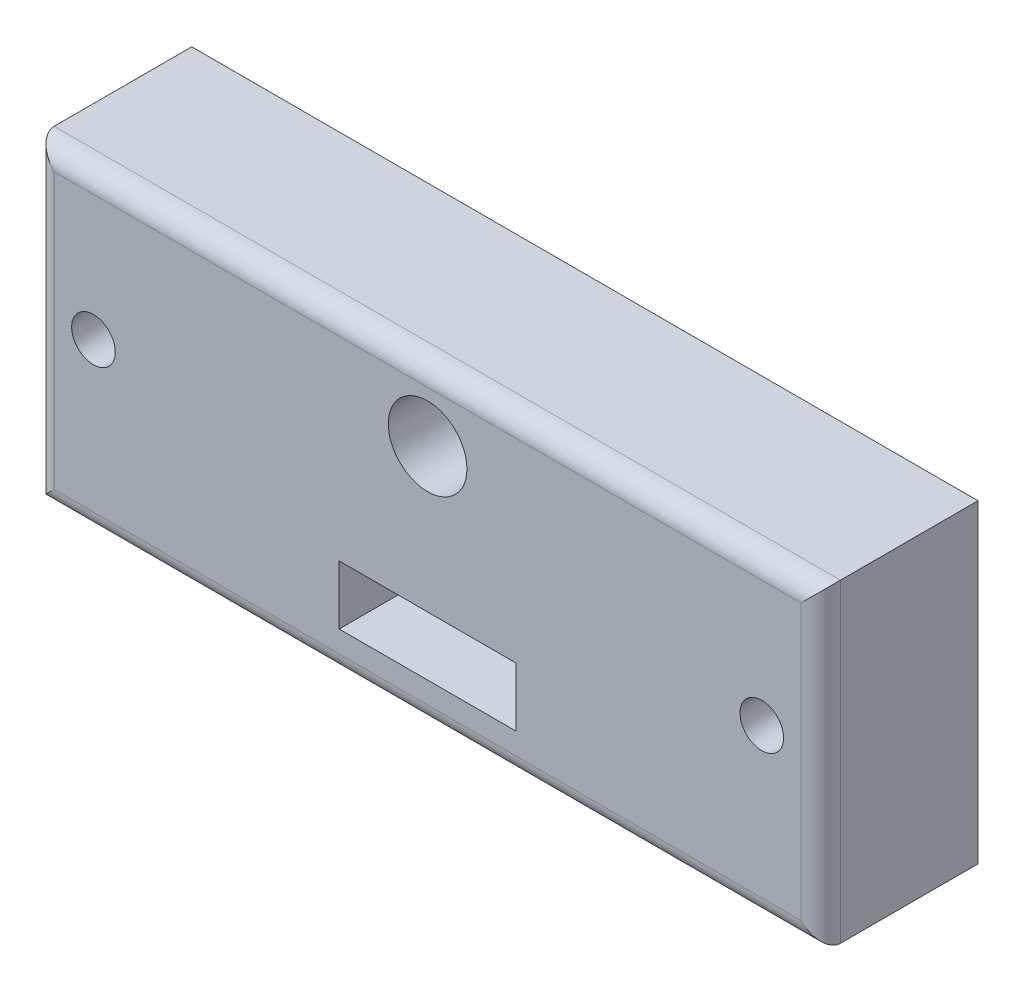
ISO-10303-21;
HEADER;
FILE_DESCRIPTION(('STEP AP214'),'2;1');
FILE_NAME('part.step','',(''),(''),'','','');
FILE_SCHEMA(('AUTOMOTIVE_DESIGN { 1 0 10303 214 1 1 1 1 }'));
ENDSEC;
DATA;
#1=APPLICATION_CONTEXT('core data for automotive mechanical design processes');
#2=APPLICATION_PROTOCOL_DEFINITION('international standard','automotive_design',2000,#1);
#3=PRODUCT_CONTEXT('',#1,'mechanical');
#4=PRODUCT('Part','Part','',(#3));
#5=PRODUCT_RELATED_PRODUCT_CATEGORY('part','',(#4));
#6=PRODUCT_DEFINITION_FORMATION('','',#4);
#7=PRODUCT_DEFINITION_CONTEXT('part definition',#1,'design');
#8=PRODUCT_DEFINITION('design','',#6,#7);
#9=PRODUCT_DEFINITION_SHAPE('','',#8);
#10=(LENGTH_UNIT() NAMED_UNIT(*) SI_UNIT(.MILLI.,.METRE.));
#11=(NAMED_UNIT(*) PLANE_ANGLE_UNIT() SI_UNIT($,.RADIAN.));
#12=(NAMED_UNIT(*) SI_UNIT($,.STERADIAN.) SOLID_ANGLE_UNIT());
#13=UNCERTAINTY_MEASURE_WITH_UNIT(LENGTH_MEASURE(1.E-05),#10,'distance_accuracy_value','');
#14=(GEOMETRIC_REPRESENTATION_CONTEXT(3) GLOBAL_UNCERTAINTY_ASSIGNED_CONTEXT((#13)) GLOBAL_UNIT_ASSIGNED_CONTEXT((#10,
#11,#12)) REPRESENTATION_CONTEXT('',''));
#15=CARTESIAN_POINT('',(0.,0.,0.));
#16=DIRECTION('',(0.,0.,1.));
#17=DIRECTION('',(1.,0.,0.));
#18=AXIS2_PLACEMENT_3D('',#15,#16,#17);
#19=CARTESIAN_POINT('',(228.6,198.303614457831,0.));
#20=DIRECTION('',(0.,0.,1.));
#21=DIRECTION('',(1.,0.,0.));
#22=AXIS2_PLACEMENT_3D('',#19,#20,#21);
#23=PLANE('',#22);
#24=CARTESIAN_POINT('',(174.625,200.208614457832,0.));
#25=DIRECTION('',(0.,0.,1.));
#26=DIRECTION('',(1.,0.,0.));
#27=AXIS2_PLACEMENT_3D('',#24,#25,#26);
#28=CIRCLE('',#27,3.52032942867692);
#29=CARTESIAN_POINT('',(178.145329428677,200.208614457832,0.));
#30=VERTEX_POINT('',#29);
#31=EDGE_CURVE('E149',#30,#30,#28,.T.);
#32=ORIENTED_EDGE('',*,*,#31,.T.);
#33=EDGE_LOOP('',(#32));
#34=FACE_BOUND('',#33,.T.);
#35=CARTESIAN_POINT('',(282.575,200.208614457832,0.));
#36=DIRECTION('',(0.,0.,1.));
#37=DIRECTION('',(1.,0.,0.));
#38=AXIS2_PLACEMENT_3D('',#35,#36,#37);
#39=CIRCLE('',#38,3.52032942867692);
#40=CARTESIAN_POINT('',(286.095329428677,200.208614457832,0.));
#41=VERTEX_POINT('',#40);
#42=EDGE_CURVE('E270',#41,#41,#39,.T.);
#43=ORIENTED_EDGE('',*,*,#42,.T.);
#44=EDGE_LOOP('',(#43));
#45=FACE_BOUND('',#44,.T.);
#46=DIRECTION('',(1.,0.,0.));
#47=VECTOR('',#46,1.);
#48=CARTESIAN_POINT('',(165.1,172.903614457831,0.));
#49=LINE('',#48,#47);
#50=CARTESIAN_POINT('',(165.1,172.903614457831,0.));
#51=VERTEX_POINT('',#50);
#52=CARTESIAN_POINT('',(292.1,172.903614457831,0.));
#53=VERTEX_POINT('',#52);
#54=EDGE_CURVE('E11',#51,#53,#49,.T.);
#55=ORIENTED_EDGE('',*,*,#54,.F.);
#56=DIRECTION('',(0.,-1.,0.));
#57=VECTOR('',#56,1.);
#58=CARTESIAN_POINT('',(165.1,223.703614457831,0.));
#59=LINE('',#58,#57);
#60=CARTESIAN_POINT('',(165.1,223.703614457831,0.));
#61=VERTEX_POINT('',#60);
#62=EDGE_CURVE('E242',#61,#51,#59,.T.);
#63=ORIENTED_EDGE('',*,*,#62,.F.);
#64=DIRECTION('',(-1.,0.,0.));
#65=VECTOR('',#64,1.);
#66=CARTESIAN_POINT('',(292.1,223.703614457831,0.));
#67=LINE('',#66,#65);
#68=CARTESIAN_POINT('',(292.1,223.703614457831,0.));
#69=VERTEX_POINT('',#68);
#70=EDGE_CURVE('E187',#69,#61,#67,.T.);
#71=ORIENTED_EDGE('',*,*,#70,.F.);
#72=DIRECTION('',(0.,1.,0.));
#73=VECTOR('',#72,1.);
#74=CARTESIAN_POINT('',(292.1,172.903614457831,0.));
#75=LINE('',#74,#73);
#76=EDGE_CURVE('E197',#53,#69,#75,.T.);
#77=ORIENTED_EDGE('',*,*,#76,.F.);
#78=EDGE_LOOP('',(#55,#63,#71,#77));
#79=FACE_BOUND('',#78,.T.);
#80=ADVANCED_FACE('F17',(#34,#45,#79),#23,.F.);
#81=CARTESIAN_POINT('',(165.1,172.903614457831,0.));
#82=DIRECTION('',(0.,-1.,0.));
#83=DIRECTION('',(-1.,0.,0.));
#84=AXIS2_PLACEMENT_3D('',#81,#82,#83);
#85=PLANE('',#84);
#86=DIRECTION('',(1.,0.,0.));
#87=VECTOR('',#86,1.);
#88=CARTESIAN_POINT('',(196.85,172.903614457831,22.225));
#89=LINE('',#88,#87);
#90=CARTESIAN_POINT('',(165.1,172.903614457831,22.225));
#91=VERTEX_POINT('',#90);
#92=CARTESIAN_POINT('',(292.1,172.903614457831,22.225));
#93=VERTEX_POINT('',#92);
#94=EDGE_CURVE('E176',#91,#93,#89,.T.);
#95=ORIENTED_EDGE('',*,*,#94,.F.);
#96=DIRECTION('',(0.,0.,1.));
#97=VECTOR('',#96,1.);
#98=CARTESIAN_POINT('',(165.1,172.903614457831,0.));
#99=LINE('',#98,#97);
#100=EDGE_CURVE('E20',#51,#91,#99,.T.);
#101=ORIENTED_EDGE('',*,*,#100,.F.);
#102=ORIENTED_EDGE('',*,*,#54,.T.);
#103=DIRECTION('',(0.,0.,1.));
#104=VECTOR('',#103,1.);
#105=CARTESIAN_POINT('',(292.1,172.903614457831,0.));
#106=LINE('',#105,#104);
#107=EDGE_CURVE('E194',#53,#93,#106,.T.);
#108=ORIENTED_EDGE('',*,*,#107,.T.);
#109=EDGE_LOOP('',(#95,#101,#102,#108));
#110=FACE_BOUND('',#109,.T.);
#111=ADVANCED_FACE('F260',(#110),#85,.T.);
#112=CARTESIAN_POINT('',(165.1,223.703614457831,0.));
#113=DIRECTION('',(-1.,0.,0.));
#114=DIRECTION('',(0.,0.,1.));
#115=AXIS2_PLACEMENT_3D('',#112,#113,#114);
#116=PLANE('',#115);
#117=DIRECTION('',(0.,-1.,0.));
#118=VECTOR('',#117,1.);
#119=CARTESIAN_POINT('',(165.1,211.003614457832,22.225));
#120=LINE('',#119,#118);
#121=CARTESIAN_POINT('',(165.1,223.703614457831,22.225));
#122=VERTEX_POINT('',#121);
#123=EDGE_CURVE('E172',#122,#91,#120,.T.);
#124=ORIENTED_EDGE('',*,*,#123,.F.);
#125=DIRECTION('',(0.,0.,1.));
#126=VECTOR('',#125,1.);
#127=CARTESIAN_POINT('',(165.1,223.703614457831,0.));
#128=LINE('',#127,#126);
#129=EDGE_CURVE('E191',#61,#122,#128,.T.);
#130=ORIENTED_EDGE('',*,*,#129,.F.);
#131=ORIENTED_EDGE('',*,*,#62,.T.);
#132=ORIENTED_EDGE('',*,*,#100,.T.);
#133=EDGE_LOOP('',(#124,#130,#131,#132));
#134=FACE_BOUND('',#133,.T.);
#135=ADVANCED_FACE('F253',(#134),#116,.T.);
#136=CARTESIAN_POINT('',(228.6,212.273614457831,13.97));
#137=DIRECTION('',(0.,0.,1.));
#138=DIRECTION('',(1.,0.,0.));
#139=AXIS2_PLACEMENT_3D('',#136,#137,#138);
#140=PLANE('',#139);
#141=CARTESIAN_POINT('',(228.6,212.273614457831,13.97));
#142=DIRECTION('',(0.,0.,-1.));
#143=DIRECTION('',(1.,0.,0.));
#144=AXIS2_PLACEMENT_3D('',#141,#142,#143);
#145=CIRCLE('',#144,6.35);
#146=CARTESIAN_POINT('',(234.95,212.273614457831,13.97));
#147=VERTEX_POINT('',#146);
#148=EDGE_CURVE('E239',#147,#147,#145,.T.);
#149=ORIENTED_EDGE('',*,*,#148,.F.);
#150=EDGE_LOOP('',(#149));
#151=FACE_BOUND('',#150,.T.);
#152=ADVANCED_FACE('F449',(#151),#140,.T.);
#153=CARTESIAN_POINT('',(228.6,212.273614457831,25.4));
#154=DIRECTION('',(0.,0.,-1.));
#155=DIRECTION('',(1.,0.,0.));
#156=AXIS2_PLACEMENT_3D('',#153,#154,#155);
#157=CYLINDRICAL_SURFACE('',#156,6.35);
#158=ORIENTED_EDGE('',*,*,#148,.T.);
#159=EDGE_LOOP('',(#158));
#160=FACE_BOUND('',#159,.T.);
#161=CARTESIAN_POINT('',(228.6,212.273614457831,25.4));
#162=DIRECTION('',(0.,0.,-1.));
#163=DIRECTION('',(1.,0.,0.));
#164=AXIS2_PLACEMENT_3D('',#161,#162,#163);
#165=CIRCLE('',#164,6.35);
#166=CARTESIAN_POINT('',(234.95,212.273614457831,25.4));
#167=VERTEX_POINT('',#166);
#168=EDGE_CURVE('E200',#167,#167,#165,.T.);
#169=ORIENTED_EDGE('',*,*,#168,.F.);
#170=EDGE_LOOP('',(#169));
#171=FACE_BOUND('',#170,.T.);
#172=ADVANCED_FACE('F461',(#160,#171),#157,.F.);
#173=CARTESIAN_POINT('',(228.6,184.333614457832,13.97));
#174=DIRECTION('',(0.,0.,-1.));
#175=DIRECTION('',(0.,-1.,0.));
#176=AXIS2_PLACEMENT_3D('',#173,#174,#175);
#177=PLANE('',#176);
#178=DIRECTION('',(-1.,0.,0.));
#179=VECTOR('',#178,1.);
#180=CARTESIAN_POINT('',(214.3125,179.571114457831,13.97));
#181=LINE('',#180,#179);
#182=CARTESIAN_POINT('',(242.8875,179.571114457831,13.97));
#183=VERTEX_POINT('',#182);
#184=CARTESIAN_POINT('',(214.3125,179.571114457831,13.97));
#185=VERTEX_POINT('',#184);
#186=EDGE_CURVE('E46',#183,#185,#181,.T.);
#187=ORIENTED_EDGE('',*,*,#186,.F.);
#188=DIRECTION('',(0.,-1.,0.));
#189=VECTOR('',#188,1.);
#190=CARTESIAN_POINT('',(242.8875,179.571114457831,13.97));
#191=LINE('',#190,#189);
#192=CARTESIAN_POINT('',(242.8875,189.096114457831,13.97));
#193=VERTEX_POINT('',#192);
#194=EDGE_CURVE('E213',#193,#183,#191,.T.);
#195=ORIENTED_EDGE('',*,*,#194,.F.);
#196=DIRECTION('',(1.,0.,0.));
#197=VECTOR('',#196,1.);
#198=CARTESIAN_POINT('',(242.8875,189.096114457831,13.97));
#199=LINE('',#198,#197);
#200=CARTESIAN_POINT('',(214.3125,189.096114457831,13.97));
#201=VERTEX_POINT('',#200);
#202=EDGE_CURVE('E171',#201,#193,#199,.T.);
#203=ORIENTED_EDGE('',*,*,#202,.F.);
#204=DIRECTION('',(0.,1.,0.));
#205=VECTOR('',#204,1.);
#206=CARTESIAN_POINT('',(214.3125,189.096114457831,13.97));
#207=LINE('',#206,#205);
#208=EDGE_CURVE('E170',#185,#201,#207,.T.);
#209=ORIENTED_EDGE('',*,*,#208,.F.);
#210=EDGE_LOOP('',(#187,#195,#203,#209));
#211=FACE_BOUND('',#210,.T.);
#212=ADVANCED_FACE('F466',(#211),#177,.F.);
#213=CARTESIAN_POINT('',(242.8875,179.571114457831,25.4));
#214=DIRECTION('',(0.,-1.,0.));
#215=DIRECTION('',(-1.,0.,0.));
#216=AXIS2_PLACEMENT_3D('',#213,#214,#215);
#217=PLANE('',#216);
#218=DIRECTION('',(-1.,0.,0.));
#219=VECTOR('',#218,1.);
#220=CARTESIAN_POINT('',(235.743749999999,179.571114457831,25.4));
#221=LINE('',#220,#219);
#222=CARTESIAN_POINT('',(242.8875,179.571114457831,25.4));
#223=VERTEX_POINT('',#222);
#224=CARTESIAN_POINT('',(214.3125,179.571114457831,25.4));
#225=VERTEX_POINT('',#224);
#226=EDGE_CURVE('E208',#223,#225,#221,.T.);
#227=ORIENTED_EDGE('',*,*,#226,.F.);
#228=DIRECTION('',(0.,0.,-1.));
#229=VECTOR('',#228,1.);
#230=CARTESIAN_POINT('',(242.8875,179.571114457831,25.4));
#231=LINE('',#230,#229);
#232=EDGE_CURVE('E217',#223,#183,#231,.T.);
#233=ORIENTED_EDGE('',*,*,#232,.T.);
#234=ORIENTED_EDGE('',*,*,#186,.T.);
#235=DIRECTION('',(0.,0.,-1.));
#236=VECTOR('',#235,1.);
#237=CARTESIAN_POINT('',(214.3125,179.571114457831,25.4));
#238=LINE('',#237,#236);
#239=EDGE_CURVE('E166',#225,#185,#238,.T.);
#240=ORIENTED_EDGE('',*,*,#239,.F.);
#241=EDGE_LOOP('',(#227,#233,#234,#240));
#242=FACE_BOUND('',#241,.T.);
#243=ADVANCED_FACE('F494',(#242),#217,.F.);
#244=CARTESIAN_POINT('',(214.3125,179.571114457831,25.4));
#245=DIRECTION('',(-1.,0.,0.));
#246=DIRECTION('',(0.,0.,1.));
#247=AXIS2_PLACEMENT_3D('',#244,#245,#246);
#248=PLANE('',#247);
#249=DIRECTION('',(0.,1.,0.));
#250=VECTOR('',#249,1.);
#251=CARTESIAN_POINT('',(214.3125,188.937364457831,25.4));
#252=LINE('',#251,#250);
#253=CARTESIAN_POINT('',(214.3125,189.096114457831,25.4));
#254=VERTEX_POINT('',#253);
#255=EDGE_CURVE('E212',#225,#254,#252,.T.);
#256=ORIENTED_EDGE('',*,*,#255,.F.);
#257=ORIENTED_EDGE('',*,*,#239,.T.);
#258=ORIENTED_EDGE('',*,*,#208,.T.);
#259=DIRECTION('',(0.,0.,-1.));
#260=VECTOR('',#259,1.);
#261=CARTESIAN_POINT('',(214.3125,189.096114457831,25.4));
#262=LINE('',#261,#260);
#263=EDGE_CURVE('E231',#254,#201,#262,.T.);
#264=ORIENTED_EDGE('',*,*,#263,.F.);
#265=EDGE_LOOP('',(#256,#257,#258,#264));
#266=FACE_BOUND('',#265,.T.);
#267=ADVANCED_FACE('F416',(#266),#248,.F.);
#268=CARTESIAN_POINT('',(214.3125,189.096114457831,25.4));
#269=DIRECTION('',(0.,1.,0.));
#270=DIRECTION('',(1.,0.,0.));
#271=AXIS2_PLACEMENT_3D('',#268,#269,#270);
#272=PLANE('',#271);
#273=DIRECTION('',(1.,0.,0.));
#274=VECTOR('',#273,1.);
#275=CARTESIAN_POINT('',(221.456249999999,189.096114457831,25.4));
#276=LINE('',#275,#274);
#277=CARTESIAN_POINT('',(242.8875,189.096114457831,25.4));
#278=VERTEX_POINT('',#277);
#279=EDGE_CURVE('E222',#254,#278,#276,.T.);
#280=ORIENTED_EDGE('',*,*,#279,.F.);
#281=ORIENTED_EDGE('',*,*,#263,.T.);
#282=ORIENTED_EDGE('',*,*,#202,.T.);
#283=DIRECTION('',(0.,0.,-1.));
#284=VECTOR('',#283,1.);
#285=CARTESIAN_POINT('',(242.8875,189.096114457831,25.4));
#286=LINE('',#285,#284);
#287=EDGE_CURVE('E218',#278,#193,#286,.T.);
#288=ORIENTED_EDGE('',*,*,#287,.F.);
#289=EDGE_LOOP('',(#280,#281,#282,#288));
#290=FACE_BOUND('',#289,.T.);
#291=ADVANCED_FACE('F410',(#290),#272,.F.);
#292=CARTESIAN_POINT('',(242.8875,189.096114457831,25.4));
#293=DIRECTION('',(1.,0.,0.));
#294=DIRECTION('',(0.,-1.,0.));
#295=AXIS2_PLACEMENT_3D('',#292,#293,#294);
#296=PLANE('',#295);
#297=DIRECTION('',(0.,-1.,0.));
#298=VECTOR('',#297,1.);
#299=CARTESIAN_POINT('',(242.8875,193.699864457831,25.4));
#300=LINE('',#299,#298);
#301=EDGE_CURVE('E204',#278,#223,#300,.T.);
#302=ORIENTED_EDGE('',*,*,#301,.F.);
#303=ORIENTED_EDGE('',*,*,#287,.T.);
#304=ORIENTED_EDGE('',*,*,#194,.T.);
#305=ORIENTED_EDGE('',*,*,#232,.F.);
#306=EDGE_LOOP('',(#302,#303,#304,#305));
#307=FACE_BOUND('',#306,.T.);
#308=ADVANCED_FACE('F415',(#307),#296,.F.);
#309=CARTESIAN_POINT('',(228.6,198.303614457831,25.4));
#310=DIRECTION('',(0.,0.,1.));
#311=DIRECTION('',(1.,0.,0.));
#312=AXIS2_PLACEMENT_3D('',#309,#310,#311);
#313=PLANE('',#312);
#314=ORIENTED_EDGE('',*,*,#301,.T.);
#315=ORIENTED_EDGE('',*,*,#226,.T.);
#316=ORIENTED_EDGE('',*,*,#255,.T.);
#317=ORIENTED_EDGE('',*,*,#279,.T.);
#318=EDGE_LOOP('',(#314,#315,#316,#317));
#319=FACE_BOUND('',#318,.T.);
#320=ORIENTED_EDGE('',*,*,#168,.T.);
#321=EDGE_LOOP('',(#320));
#322=FACE_BOUND('',#321,.T.);
#323=CARTESIAN_POINT('',(174.625,200.208614457832,25.4));
#324=DIRECTION('',(0.,0.,-1.));
#325=DIRECTION('',(1.,0.,0.));
#326=AXIS2_PLACEMENT_3D('',#323,#324,#325);
#327=CIRCLE('',#326,3.52032942867692);
#328=CARTESIAN_POINT('',(178.145329428677,200.208614457832,25.4));
#329=VERTEX_POINT('',#328);
#330=EDGE_CURVE('E158',#329,#329,#327,.T.);
#331=ORIENTED_EDGE('',*,*,#330,.T.);
#332=EDGE_LOOP('',(#331));
#333=FACE_BOUND('',#332,.T.);
#334=CARTESIAN_POINT('',(282.575,200.208614457832,25.4));
#335=DIRECTION('',(0.,0.,-1.));
#336=DIRECTION('',(1.,0.,0.));
#337=AXIS2_PLACEMENT_3D('',#334,#335,#336);
#338=CIRCLE('',#337,3.52032942867692);
#339=CARTESIAN_POINT('',(286.095329428677,200.208614457832,25.4));
#340=VERTEX_POINT('',#339);
#341=EDGE_CURVE('E280',#340,#340,#338,.T.);
#342=ORIENTED_EDGE('',*,*,#341,.T.);
#343=EDGE_LOOP('',(#342));
#344=FACE_BOUND('',#343,.T.);
#345=DIRECTION('',(0.,-1.,0.));
#346=VECTOR('',#345,1.);
#347=CARTESIAN_POINT('',(288.925,185.603614457831,25.4));
#348=LINE('',#347,#346);
#349=CARTESIAN_POINT('',(288.925,220.528614457832,25.4));
#350=VERTEX_POINT('',#349);
#351=CARTESIAN_POINT('',(288.925,176.078614457831,25.4));
#352=VERTEX_POINT('',#351);
#353=EDGE_CURVE('E138',#350,#352,#348,.T.);
#354=ORIENTED_EDGE('',*,*,#353,.F.);
#355=DIRECTION('',(1.,0.,0.));
#356=VECTOR('',#355,1.);
#357=CARTESIAN_POINT('',(260.35,220.528614457832,25.4));
#358=LINE('',#357,#356);
#359=CARTESIAN_POINT('',(168.275,220.528614457832,25.4));
#360=VERTEX_POINT('',#359);
#361=EDGE_CURVE('E119',#360,#350,#358,.T.);
#362=ORIENTED_EDGE('',*,*,#361,.F.);
#363=DIRECTION('',(0.,1.,0.));
#364=VECTOR('',#363,1.);
#365=CARTESIAN_POINT('',(168.275,211.003614457832,25.4));
#366=LINE('',#365,#364);
#367=CARTESIAN_POINT('',(168.275,176.078614457831,25.4));
#368=VERTEX_POINT('',#367);
#369=EDGE_CURVE('E180',#368,#360,#366,.T.);
#370=ORIENTED_EDGE('',*,*,#369,.F.);
#371=DIRECTION('',(-1.,0.,0.));
#372=VECTOR('',#371,1.);
#373=CARTESIAN_POINT('',(196.85,176.078614457831,25.4));
#374=LINE('',#373,#372);
#375=EDGE_CURVE('E142',#352,#368,#374,.T.);
#376=ORIENTED_EDGE('',*,*,#375,.F.);
#377=EDGE_LOOP('',(#354,#362,#370,#376));
#378=FACE_BOUND('',#377,.T.);
#379=ADVANCED_FACE('F144',(#319,#322,#333,#344,#378),#313,.T.);
#380=CARTESIAN_POINT('',(292.1,172.903614457831,0.));
#381=DIRECTION('',(1.,0.,0.));
#382=DIRECTION('',(0.,-1.,0.));
#383=AXIS2_PLACEMENT_3D('',#380,#381,#382);
#384=PLANE('',#383);
#385=DIRECTION('',(0.,1.,0.));
#386=VECTOR('',#385,1.);
#387=CARTESIAN_POINT('',(292.1,185.603614457831,22.225));
#388=LINE('',#387,#386);
#389=CARTESIAN_POINT('',(292.1,223.703614457831,22.225));
#390=VERTEX_POINT('',#389);
#391=EDGE_CURVE('E140',#93,#390,#388,.T.);
#392=ORIENTED_EDGE('',*,*,#391,.F.);
#393=ORIENTED_EDGE('',*,*,#107,.F.);
#394=ORIENTED_EDGE('',*,*,#76,.T.);
#395=DIRECTION('',(0.,0.,1.));
#396=VECTOR('',#395,1.);
#397=CARTESIAN_POINT('',(292.1,223.703614457831,0.));
#398=LINE('',#397,#396);
#399=EDGE_CURVE('E131',#69,#390,#398,.T.);
#400=ORIENTED_EDGE('',*,*,#399,.T.);
#401=EDGE_LOOP('',(#392,#393,#394,#400));
#402=FACE_BOUND('',#401,.T.);
#403=ADVANCED_FACE('F299',(#402),#384,.T.);
#404=CARTESIAN_POINT('',(292.1,223.703614457831,0.));
#405=DIRECTION('',(0.,1.,0.));
#406=DIRECTION('',(1.,0.,0.));
#407=AXIS2_PLACEMENT_3D('',#404,#405,#406);
#408=PLANE('',#407);
#409=DIRECTION('',(-1.,0.,0.));
#410=VECTOR('',#409,1.);
#411=CARTESIAN_POINT('',(260.35,223.703614457831,22.225));
#412=LINE('',#411,#410);
#413=EDGE_CURVE('E132',#390,#122,#412,.T.);
#414=ORIENTED_EDGE('',*,*,#413,.F.);
#415=ORIENTED_EDGE('',*,*,#399,.F.);
#416=ORIENTED_EDGE('',*,*,#70,.T.);
#417=ORIENTED_EDGE('',*,*,#129,.T.);
#418=EDGE_LOOP('',(#414,#415,#416,#417));
#419=FACE_BOUND('',#418,.T.);
#420=ADVANCED_FACE('F302',(#419),#408,.T.);
#421=CARTESIAN_POINT('',(260.35,220.528614457832,22.225));
#422=DIRECTION('',(-1.,0.,0.));
#423=DIRECTION('',(0.,0.70710678118655,0.707106781186545));
#424=AXIS2_PLACEMENT_3D('',#421,#422,#423);
#425=CYLINDRICAL_SURFACE('',#424,3.175);
#426=ORIENTED_EDGE('',*,*,#413,.T.);
#427=CARTESIAN_POINT('',(168.275,220.528614457832,22.225));
#428=DIRECTION('',(-0.707106781186548,-0.707106781186548,0.));
#429=DIRECTION('',(-0.707106781186548,0.707106781186548,0.));
#430=AXIS2_PLACEMENT_3D('',#427,#428,#429);
#431=ELLIPSE('',#430,4.49012806053458,3.175);
#432=EDGE_CURVE('E126',#360,#122,#431,.T.);
#433=ORIENTED_EDGE('',*,*,#432,.F.);
#434=ORIENTED_EDGE('',*,*,#361,.T.);
#435=CARTESIAN_POINT('',(288.925,220.528614457832,22.225));
#436=DIRECTION('',(-0.707106781186548,0.707106781186548,0.));
#437=DIRECTION('',(0.707106781186548,0.707106781186548,0.));
#438=AXIS2_PLACEMENT_3D('',#435,#436,#437);
#439=ELLIPSE('',#438,4.49012806053458,3.175);
#440=EDGE_CURVE('E123',#350,#390,#439,.T.);
#441=ORIENTED_EDGE('',*,*,#440,.T.);
#442=EDGE_LOOP('',(#426,#433,#434,#441));
#443=FACE_BOUND('',#442,.T.);
#444=ADVANCED_FACE('F122',(#443),#425,.T.);
#445=CARTESIAN_POINT('',(168.275,211.003614457832,22.225));
#446=DIRECTION('',(0.,-1.,0.));
#447=DIRECTION('',(-0.707106781186543,0.,0.707106781186552));
#448=AXIS2_PLACEMENT_3D('',#445,#446,#447);
#449=CYLINDRICAL_SURFACE('',#448,3.175);
#450=ORIENTED_EDGE('',*,*,#369,.T.);
#451=ORIENTED_EDGE('',*,*,#432,.T.);
#452=ORIENTED_EDGE('',*,*,#123,.T.);
#453=CARTESIAN_POINT('',(168.275,176.078614457831,22.225));
#454=DIRECTION('',(0.707106781186548,-0.707106781186548,0.));
#455=DIRECTION('',(-0.707106781186548,-0.707106781186548,0.));
#456=AXIS2_PLACEMENT_3D('',#453,#454,#455);
#457=ELLIPSE('',#456,4.49012806053458,3.175);
#458=EDGE_CURVE('E165',#368,#91,#457,.T.);
#459=ORIENTED_EDGE('',*,*,#458,.F.);
#460=EDGE_LOOP('',(#450,#451,#452,#459));
#461=FACE_BOUND('',#460,.T.);
#462=ADVANCED_FACE('F258',(#461),#449,.T.);
#463=CARTESIAN_POINT('',(196.85,176.078614457831,22.225));
#464=DIRECTION('',(1.,0.,0.));
#465=DIRECTION('',(0.,-0.70710678118655,0.707106781186545));
#466=AXIS2_PLACEMENT_3D('',#463,#464,#465);
#467=CYLINDRICAL_SURFACE('',#466,3.175);
#468=ORIENTED_EDGE('',*,*,#375,.T.);
#469=ORIENTED_EDGE('',*,*,#458,.T.);
#470=ORIENTED_EDGE('',*,*,#94,.T.);
#471=CARTESIAN_POINT('',(288.925,176.078614457831,22.225));
#472=DIRECTION('',(0.707106781186548,0.707106781186548,0.));
#473=DIRECTION('',(0.707106781186548,-0.707106781186548,0.));
#474=AXIS2_PLACEMENT_3D('',#471,#472,#473);
#475=ELLIPSE('',#474,4.49012806053458,3.175);
#476=EDGE_CURVE('E148',#352,#93,#475,.T.);
#477=ORIENTED_EDGE('',*,*,#476,.F.);
#478=EDGE_LOOP('',(#468,#469,#470,#477));
#479=FACE_BOUND('',#478,.T.);
#480=ADVANCED_FACE('F263',(#479),#467,.T.);
#481=CARTESIAN_POINT('',(288.925,185.603614457831,22.225));
#482=DIRECTION('',(0.,1.,0.));
#483=DIRECTION('',(0.70710678118655,0.,0.707106781186545));
#484=AXIS2_PLACEMENT_3D('',#481,#482,#483);
#485=CYLINDRICAL_SURFACE('',#484,3.175);
#486=ORIENTED_EDGE('',*,*,#353,.T.);
#487=ORIENTED_EDGE('',*,*,#476,.T.);
#488=ORIENTED_EDGE('',*,*,#391,.T.);
#489=ORIENTED_EDGE('',*,*,#440,.F.);
#490=EDGE_LOOP('',(#486,#487,#488,#489));
#491=FACE_BOUND('',#490,.T.);
#492=ADVANCED_FACE('F136',(#491),#485,.T.);
#493=CARTESIAN_POINT('',(174.625,200.208614457832,25.4));
#494=DIRECTION('',(0.,0.,-1.));
#495=DIRECTION('',(1.,0.,0.));
#496=AXIS2_PLACEMENT_3D('',#493,#494,#495);
#497=CYLINDRICAL_SURFACE('',#496,3.52032942867692);
#498=ORIENTED_EDGE('',*,*,#31,.F.);
#499=EDGE_LOOP('',(#498));
#500=FACE_BOUND('',#499,.T.);
#501=ORIENTED_EDGE('',*,*,#330,.F.);
#502=EDGE_LOOP('',(#501));
#503=FACE_BOUND('',#502,.T.);
#504=ADVANCED_FACE('F387',(#500,#503),#497,.F.);
#505=CARTESIAN_POINT('',(282.575,200.208614457832,25.4));
#506=DIRECTION('',(0.,0.,-1.));
#507=DIRECTION('',(1.,0.,0.));
#508=AXIS2_PLACEMENT_3D('',#505,#506,#507);
#509=CYLINDRICAL_SURFACE('',#508,3.52032942867692);
#510=ORIENTED_EDGE('',*,*,#42,.F.);
#511=EDGE_LOOP('',(#510));
#512=FACE_BOUND('',#511,.T.);
#513=ORIENTED_EDGE('',*,*,#341,.F.);
#514=EDGE_LOOP('',(#513));
#515=FACE_BOUND('',#514,.T.);
#516=ADVANCED_FACE('F382',(#512,#515),#509,.F.);
#517=CLOSED_SHELL('',(#80,#111,#135,#152,#172,#212,#243,#267,#291,#308,#379,#403,#420,#444,#462,
#480,#492,#504,#516));
#518=MANIFOLD_SOLID_BREP('B1',#517);
#519=ADVANCED_BREP_SHAPE_REPRESENTATION('',(#18,#518),#14);
#520=SHAPE_DEFINITION_REPRESENTATION(#9,#519);
ENDSEC;
END-ISO-10303-21;
